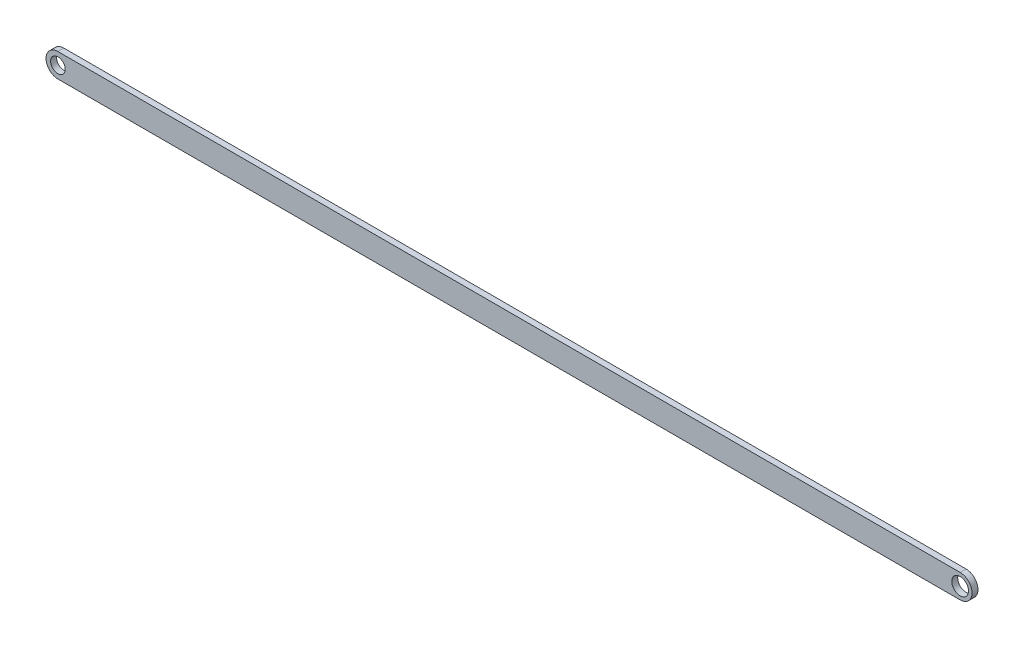
ISO-10303-21;
HEADER;
FILE_DESCRIPTION(('STEP AP214'),'2;1');
FILE_NAME('part.step','',(''),(''),'','','');
FILE_SCHEMA(('AUTOMOTIVE_DESIGN { 1 0 10303 214 1 1 1 1 }'));
ENDSEC;
DATA;
#1=APPLICATION_CONTEXT('core data for automotive mechanical design processes');
#2=APPLICATION_PROTOCOL_DEFINITION('international standard','automotive_design',2000,#1);
#3=PRODUCT_CONTEXT('',#1,'mechanical');
#4=PRODUCT('Part','Part','',(#3));
#5=PRODUCT_RELATED_PRODUCT_CATEGORY('part','',(#4));
#6=PRODUCT_DEFINITION_FORMATION('','',#4);
#7=PRODUCT_DEFINITION_CONTEXT('part definition',#1,'design');
#8=PRODUCT_DEFINITION('design','',#6,#7);
#9=PRODUCT_DEFINITION_SHAPE('','',#8);
#10=(LENGTH_UNIT() NAMED_UNIT(*) SI_UNIT(.MILLI.,.METRE.));
#11=(NAMED_UNIT(*) PLANE_ANGLE_UNIT() SI_UNIT($,.RADIAN.));
#12=(NAMED_UNIT(*) SI_UNIT($,.STERADIAN.) SOLID_ANGLE_UNIT());
#13=UNCERTAINTY_MEASURE_WITH_UNIT(LENGTH_MEASURE(1.E-05),#10,'distance_accuracy_value','');
#14=(GEOMETRIC_REPRESENTATION_CONTEXT(3) GLOBAL_UNCERTAINTY_ASSIGNED_CONTEXT((#13)) GLOBAL_UNIT_ASSIGNED_CONTEXT((#10,
#11,#12)) REPRESENTATION_CONTEXT('',''));
#15=CARTESIAN_POINT('',(0.,0.,0.));
#16=DIRECTION('',(0.,0.,1.));
#17=DIRECTION('',(1.,0.,0.));
#18=AXIS2_PLACEMENT_3D('',#15,#16,#17);
#19=CARTESIAN_POINT('',(-378.7,0.,5.));
#20=DIRECTION('',(0.,0.,1.));
#21=DIRECTION('',(1.,0.,0.));
#22=AXIS2_PLACEMENT_3D('',#19,#20,#21);
#23=PLANE('',#22);
#24=CARTESIAN_POINT('',(-378.7,0.,5.));
#25=DIRECTION('',(0.,0.,1.));
#26=DIRECTION('',(1.,0.,0.));
#27=AXIS2_PLACEMENT_3D('',#24,#25,#26);
#28=CIRCLE('',#27,6.14426680345984);
#29=CARTESIAN_POINT('',(-372.55573319654,0.,5.));
#30=VERTEX_POINT('',#29);
#31=EDGE_CURVE('E101',#30,#30,#28,.T.);
#32=ORIENTED_EDGE('',*,*,#31,.F.);
#33=EDGE_LOOP('',(#32));
#34=FACE_BOUND('',#33,.T.);
#35=CARTESIAN_POINT('',(-378.7,0.,5.));
#36=DIRECTION('',(0.,0.,1.));
#37=DIRECTION('',(1.,0.,0.));
#38=AXIS2_PLACEMENT_3D('',#35,#36,#37);
#39=CIRCLE('',#38,10.);
#40=CARTESIAN_POINT('',(-378.7,10.,5.));
#41=VERTEX_POINT('',#40);
#42=CARTESIAN_POINT('',(-378.7,-10.,5.));
#43=VERTEX_POINT('',#42);
#44=EDGE_CURVE('E86',#41,#43,#39,.T.);
#45=ORIENTED_EDGE('',*,*,#44,.T.);
#46=DIRECTION('',(1.,0.,0.));
#47=VECTOR('',#46,1.);
#48=CARTESIAN_POINT('',(-378.7,-10.,5.));
#49=LINE('',#48,#47);
#50=CARTESIAN_POINT('',(378.7,-10.,5.));
#51=VERTEX_POINT('',#50);
#52=EDGE_CURVE('E81',#43,#51,#49,.T.);
#53=ORIENTED_EDGE('',*,*,#52,.T.);
#54=CARTESIAN_POINT('',(378.7,0.,5.));
#55=DIRECTION('',(0.,0.,1.));
#56=DIRECTION('',(1.,0.,0.));
#57=AXIS2_PLACEMENT_3D('',#54,#55,#56);
#58=CIRCLE('',#57,10.);
#59=CARTESIAN_POINT('',(378.7,10.,5.));
#60=VERTEX_POINT('',#59);
#61=EDGE_CURVE('E84',#51,#60,#58,.T.);
#62=ORIENTED_EDGE('',*,*,#61,.T.);
#63=DIRECTION('',(-1.,0.,0.));
#64=VECTOR('',#63,1.);
#65=CARTESIAN_POINT('',(-378.7,10.,5.));
#66=LINE('',#65,#64);
#67=EDGE_CURVE('E51',#60,#41,#66,.T.);
#68=ORIENTED_EDGE('',*,*,#67,.T.);
#69=EDGE_LOOP('',(#45,#53,#62,#68));
#70=FACE_BOUND('',#69,.T.);
#71=CARTESIAN_POINT('',(378.7,0.,5.));
#72=DIRECTION('',(0.,0.,1.));
#73=DIRECTION('',(1.,0.,0.));
#74=AXIS2_PLACEMENT_3D('',#71,#72,#73);
#75=CIRCLE('',#74,7.0322991567);
#76=CARTESIAN_POINT('',(385.7322991567,0.,5.));
#77=VERTEX_POINT('',#76);
#78=EDGE_CURVE('E116',#77,#77,#75,.T.);
#79=ORIENTED_EDGE('',*,*,#78,.F.);
#80=EDGE_LOOP('',(#79));
#81=FACE_BOUND('',#80,.T.);
#82=ADVANCED_FACE('F34',(#34,#70,#81),#23,.T.);
#83=CARTESIAN_POINT('',(-378.7,0.,0.));
#84=DIRECTION('',(0.,0.,1.));
#85=DIRECTION('',(1.,0.,0.));
#86=AXIS2_PLACEMENT_3D('',#83,#84,#85);
#87=PLANE('',#86);
#88=CARTESIAN_POINT('',(-378.7,0.,0.));
#89=DIRECTION('',(0.,0.,1.));
#90=DIRECTION('',(1.,0.,0.));
#91=AXIS2_PLACEMENT_3D('',#88,#89,#90);
#92=CIRCLE('',#91,10.);
#93=CARTESIAN_POINT('',(-378.7,10.,0.));
#94=VERTEX_POINT('',#93);
#95=CARTESIAN_POINT('',(-378.7,-10.,0.));
#96=VERTEX_POINT('',#95);
#97=EDGE_CURVE('E98',#94,#96,#92,.T.);
#98=ORIENTED_EDGE('',*,*,#97,.F.);
#99=DIRECTION('',(-1.,0.,0.));
#100=VECTOR('',#99,1.);
#101=CARTESIAN_POINT('',(-378.7,10.,0.));
#102=LINE('',#101,#100);
#103=CARTESIAN_POINT('',(378.7,10.,0.));
#104=VERTEX_POINT('',#103);
#105=EDGE_CURVE('E74',#104,#94,#102,.T.);
#106=ORIENTED_EDGE('',*,*,#105,.F.);
#107=CARTESIAN_POINT('',(378.7,0.,0.));
#108=DIRECTION('',(0.,0.,1.));
#109=DIRECTION('',(1.,0.,0.));
#110=AXIS2_PLACEMENT_3D('',#107,#108,#109);
#111=CIRCLE('',#110,10.);
#112=CARTESIAN_POINT('',(378.7,-10.,0.));
#113=VERTEX_POINT('',#112);
#114=EDGE_CURVE('E68',#113,#104,#111,.T.);
#115=ORIENTED_EDGE('',*,*,#114,.F.);
#116=DIRECTION('',(1.,0.,0.));
#117=VECTOR('',#116,1.);
#118=CARTESIAN_POINT('',(-378.7,-10.,0.));
#119=LINE('',#118,#117);
#120=EDGE_CURVE('E90',#96,#113,#119,.T.);
#121=ORIENTED_EDGE('',*,*,#120,.F.);
#122=EDGE_LOOP('',(#98,#106,#115,#121));
#123=FACE_BOUND('',#122,.T.);
#124=CARTESIAN_POINT('',(-378.7,0.,0.));
#125=DIRECTION('',(0.,0.,1.));
#126=DIRECTION('',(1.,0.,0.));
#127=AXIS2_PLACEMENT_3D('',#124,#125,#126);
#128=CIRCLE('',#127,6.14426680345984);
#129=CARTESIAN_POINT('',(-372.55573319654,0.,0.));
#130=VERTEX_POINT('',#129);
#131=EDGE_CURVE('E113',#130,#130,#128,.T.);
#132=ORIENTED_EDGE('',*,*,#131,.T.);
#133=EDGE_LOOP('',(#132));
#134=FACE_BOUND('',#133,.T.);
#135=CARTESIAN_POINT('',(378.7,0.,0.));
#136=DIRECTION('',(0.,0.,1.));
#137=DIRECTION('',(1.,0.,0.));
#138=AXIS2_PLACEMENT_3D('',#135,#136,#137);
#139=CIRCLE('',#138,7.0322991567);
#140=CARTESIAN_POINT('',(385.7322991567,0.,0.));
#141=VERTEX_POINT('',#140);
#142=EDGE_CURVE('E119',#141,#141,#139,.T.);
#143=ORIENTED_EDGE('',*,*,#142,.T.);
#144=EDGE_LOOP('',(#143));
#145=FACE_BOUND('',#144,.T.);
#146=ADVANCED_FACE('F109',(#123,#134,#145),#87,.F.);
#147=CARTESIAN_POINT('',(-378.7,0.,5.));
#148=DIRECTION('',(0.,0.,-1.));
#149=DIRECTION('',(-1.,0.,0.));
#150=AXIS2_PLACEMENT_3D('',#147,#148,#149);
#151=CYLINDRICAL_SURFACE('',#150,10.);
#152=ORIENTED_EDGE('',*,*,#97,.T.);
#153=DIRECTION('',(0.,0.,-1.));
#154=VECTOR('',#153,1.);
#155=CARTESIAN_POINT('',(-378.7,-10.,5.));
#156=LINE('',#155,#154);
#157=EDGE_CURVE('E11',#43,#96,#156,.T.);
#158=ORIENTED_EDGE('',*,*,#157,.F.);
#159=ORIENTED_EDGE('',*,*,#44,.F.);
#160=DIRECTION('',(0.,0.,-1.));
#161=VECTOR('',#160,1.);
#162=CARTESIAN_POINT('',(-378.7,10.,5.));
#163=LINE('',#162,#161);
#164=EDGE_CURVE('E94',#41,#94,#163,.T.);
#165=ORIENTED_EDGE('',*,*,#164,.T.);
#166=EDGE_LOOP('',(#152,#158,#159,#165));
#167=FACE_BOUND('',#166,.T.);
#168=ADVANCED_FACE('F36',(#167),#151,.T.);
#169=CARTESIAN_POINT('',(-378.7,-10.,5.));
#170=DIRECTION('',(0.,1.,0.));
#171=DIRECTION('',(0.,0.,1.));
#172=AXIS2_PLACEMENT_3D('',#169,#170,#171);
#173=PLANE('',#172);
#174=ORIENTED_EDGE('',*,*,#120,.T.);
#175=DIRECTION('',(0.,0.,-1.));
#176=VECTOR('',#175,1.);
#177=CARTESIAN_POINT('',(378.7,-10.,5.));
#178=LINE('',#177,#176);
#179=EDGE_CURVE('E43',#51,#113,#178,.T.);
#180=ORIENTED_EDGE('',*,*,#179,.F.);
#181=ORIENTED_EDGE('',*,*,#52,.F.);
#182=ORIENTED_EDGE('',*,*,#157,.T.);
#183=EDGE_LOOP('',(#174,#180,#181,#182));
#184=FACE_BOUND('',#183,.T.);
#185=ADVANCED_FACE('F89',(#184),#173,.F.);
#186=CARTESIAN_POINT('',(378.7,0.,5.));
#187=DIRECTION('',(0.,0.,-1.));
#188=DIRECTION('',(-1.,0.,0.));
#189=AXIS2_PLACEMENT_3D('',#186,#187,#188);
#190=CYLINDRICAL_SURFACE('',#189,10.);
#191=ORIENTED_EDGE('',*,*,#114,.T.);
#192=DIRECTION('',(0.,0.,-1.));
#193=VECTOR('',#192,1.);
#194=CARTESIAN_POINT('',(378.7,10.,5.));
#195=LINE('',#194,#193);
#196=EDGE_CURVE('E91',#60,#104,#195,.T.);
#197=ORIENTED_EDGE('',*,*,#196,.F.);
#198=ORIENTED_EDGE('',*,*,#61,.F.);
#199=ORIENTED_EDGE('',*,*,#179,.T.);
#200=EDGE_LOOP('',(#191,#197,#198,#199));
#201=FACE_BOUND('',#200,.T.);
#202=ADVANCED_FACE('F92',(#201),#190,.T.);
#203=CARTESIAN_POINT('',(-378.7,10.,5.));
#204=DIRECTION('',(0.,-1.,0.));
#205=DIRECTION('',(0.,0.,-1.));
#206=AXIS2_PLACEMENT_3D('',#203,#204,#205);
#207=PLANE('',#206);
#208=ORIENTED_EDGE('',*,*,#105,.T.);
#209=ORIENTED_EDGE('',*,*,#164,.F.);
#210=ORIENTED_EDGE('',*,*,#67,.F.);
#211=ORIENTED_EDGE('',*,*,#196,.T.);
#212=EDGE_LOOP('',(#208,#209,#210,#211));
#213=FACE_BOUND('',#212,.T.);
#214=ADVANCED_FACE('F106',(#213),#207,.F.);
#215=CARTESIAN_POINT('',(-378.7,0.,5.));
#216=DIRECTION('',(0.,0.,-1.));
#217=DIRECTION('',(-1.,0.,0.));
#218=AXIS2_PLACEMENT_3D('',#215,#216,#217);
#219=CYLINDRICAL_SURFACE('',#218,6.14426680345984);
#220=ORIENTED_EDGE('',*,*,#31,.T.);
#221=EDGE_LOOP('',(#220));
#222=FACE_BOUND('',#221,.T.);
#223=ORIENTED_EDGE('',*,*,#131,.F.);
#224=EDGE_LOOP('',(#223));
#225=FACE_BOUND('',#224,.T.);
#226=ADVANCED_FACE('F136',(#222,#225),#219,.F.);
#227=CARTESIAN_POINT('',(378.7,0.,5.));
#228=DIRECTION('',(0.,0.,-1.));
#229=DIRECTION('',(-1.,0.,0.));
#230=AXIS2_PLACEMENT_3D('',#227,#228,#229);
#231=CYLINDRICAL_SURFACE('',#230,7.0322991567);
#232=ORIENTED_EDGE('',*,*,#78,.T.);
#233=EDGE_LOOP('',(#232));
#234=FACE_BOUND('',#233,.T.);
#235=ORIENTED_EDGE('',*,*,#142,.F.);
#236=EDGE_LOOP('',(#235));
#237=FACE_BOUND('',#236,.T.);
#238=ADVANCED_FACE('F125',(#234,#237),#231,.F.);
#239=CLOSED_SHELL('',(#82,#146,#168,#185,#202,#214,#226,#238));
#240=MANIFOLD_SOLID_BREP('B2',#239);
#241=ADVANCED_BREP_SHAPE_REPRESENTATION('',(#18,#240),#14);
#242=SHAPE_DEFINITION_REPRESENTATION(#9,#241);
ENDSEC;
END-ISO-10303-21;
